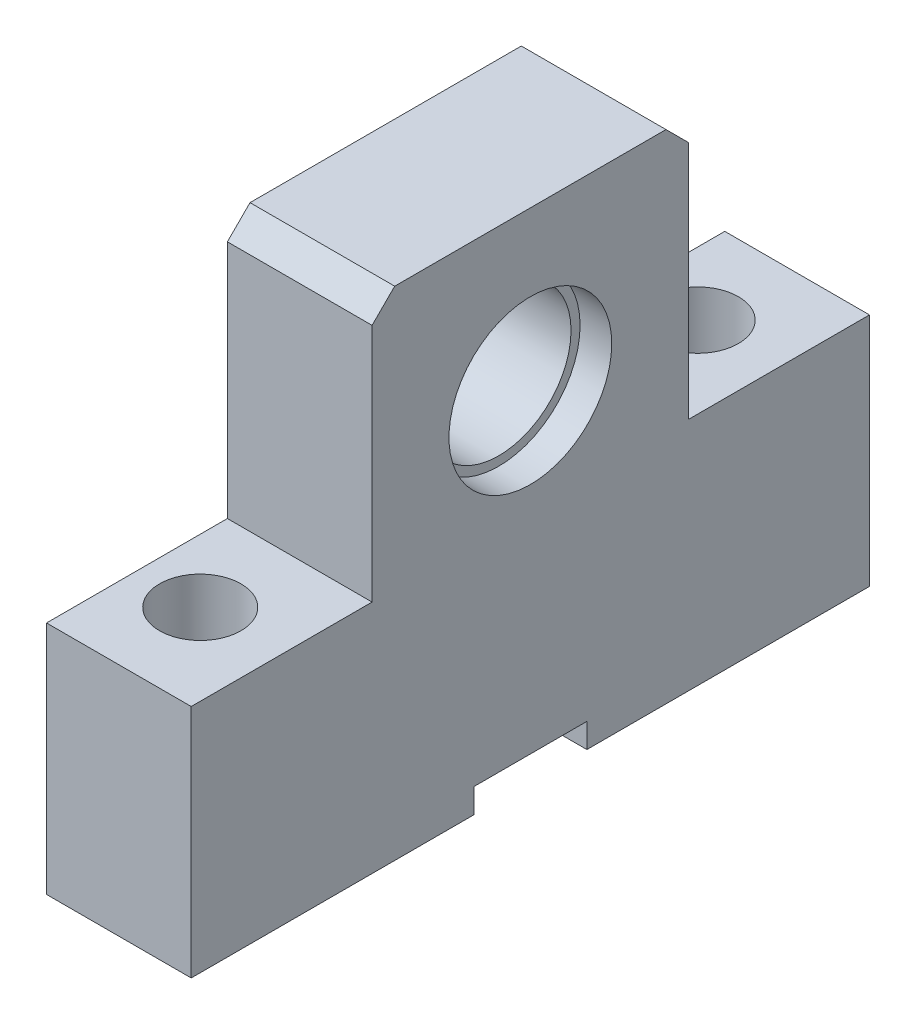
ISO-10303-21;
HEADER;
FILE_DESCRIPTION(('STEP AP214'),'2;1');
FILE_NAME('part.step','',(''),(''),'','','');
FILE_SCHEMA(('AUTOMOTIVE_DESIGN { 1 0 10303 214 1 1 1 1 }'));
ENDSEC;
DATA;
#1=APPLICATION_CONTEXT('core data for automotive mechanical design processes');
#2=APPLICATION_PROTOCOL_DEFINITION('international standard','automotive_design',2000,#1);
#3=PRODUCT_CONTEXT('',#1,'mechanical');
#4=PRODUCT('Part','Part','',(#3));
#5=PRODUCT_RELATED_PRODUCT_CATEGORY('part','',(#4));
#6=PRODUCT_DEFINITION_FORMATION('','',#4);
#7=PRODUCT_DEFINITION_CONTEXT('part definition',#1,'design');
#8=PRODUCT_DEFINITION('design','',#6,#7);
#9=PRODUCT_DEFINITION_SHAPE('','',#8);
#10=(LENGTH_UNIT() NAMED_UNIT(*) SI_UNIT(.MILLI.,.METRE.));
#11=(NAMED_UNIT(*) PLANE_ANGLE_UNIT() SI_UNIT($,.RADIAN.));
#12=(NAMED_UNIT(*) SI_UNIT($,.STERADIAN.) SOLID_ANGLE_UNIT());
#13=UNCERTAINTY_MEASURE_WITH_UNIT(LENGTH_MEASURE(1.E-05),#10,'distance_accuracy_value','');
#14=(GEOMETRIC_REPRESENTATION_CONTEXT(3) GLOBAL_UNCERTAINTY_ASSIGNED_CONTEXT((#13)) GLOBAL_UNIT_ASSIGNED_CONTEXT((#10,
#11,#12)) REPRESENTATION_CONTEXT('',''));
#15=CARTESIAN_POINT('',(0.,0.,0.));
#16=DIRECTION('',(0.,0.,1.));
#17=DIRECTION('',(1.,0.,0.));
#18=AXIS2_PLACEMENT_3D('',#15,#16,#17);
#19=CARTESIAN_POINT('',(33.,-75.,75.));
#20=DIRECTION('',(0.,1.,0.));
#21=DIRECTION('',(0.,0.,1.));
#22=AXIS2_PLACEMENT_3D('',#19,#20,#21);
#23=PLANE('',#22);
#24=CARTESIAN_POINT('',(15.,-75.,55.));
#25=DIRECTION('',(0.,-1.,0.));
#26=DIRECTION('',(0.,0.,1.));
#27=AXIS2_PLACEMENT_3D('',#24,#25,#26);
#28=CIRCLE('',#27,9.);
#29=CARTESIAN_POINT('',(15.,-75.,64.));
#30=VERTEX_POINT('',#29);
#31=EDGE_CURVE('E145',#30,#30,#28,.T.);
#32=ORIENTED_EDGE('',*,*,#31,.F.);
#33=EDGE_LOOP('',(#32));
#34=FACE_BOUND('',#33,.T.);
#35=DIRECTION('',(-1.,0.,0.));
#36=VECTOR('',#35,1.);
#37=CARTESIAN_POINT('',(33.,-75.,12.5));
#38=LINE('',#37,#36);
#39=CARTESIAN_POINT('',(33.,-75.,12.5));
#40=VERTEX_POINT('',#39);
#41=CARTESIAN_POINT('',(1.,-75.,12.5));
#42=VERTEX_POINT('',#41);
#43=EDGE_CURVE('E133',#40,#42,#38,.T.);
#44=ORIENTED_EDGE('',*,*,#43,.F.);
#45=DIRECTION('',(0.,0.,-1.));
#46=VECTOR('',#45,1.);
#47=CARTESIAN_POINT('',(33.,-75.,75.));
#48=LINE('',#47,#46);
#49=CARTESIAN_POINT('',(33.,-75.,75.));
#50=VERTEX_POINT('',#49);
#51=EDGE_CURVE('E121',#50,#40,#48,.T.);
#52=ORIENTED_EDGE('',*,*,#51,.F.);
#53=DIRECTION('',(-1.,0.,0.));
#54=VECTOR('',#53,1.);
#55=CARTESIAN_POINT('',(33.,-75.,75.));
#56=LINE('',#55,#54);
#57=CARTESIAN_POINT('',(1.,-75.,75.));
#58=VERTEX_POINT('',#57);
#59=EDGE_CURVE('E132',#50,#58,#56,.T.);
#60=ORIENTED_EDGE('',*,*,#59,.T.);
#61=DIRECTION('',(0.,0.,-1.));
#62=VECTOR('',#61,1.);
#63=CARTESIAN_POINT('',(1.,-75.,75.));
#64=LINE('',#63,#62);
#65=EDGE_CURVE('E144',#58,#42,#64,.T.);
#66=ORIENTED_EDGE('',*,*,#65,.T.);
#67=EDGE_LOOP('',(#44,#52,#60,#66));
#68=FACE_BOUND('',#67,.T.);
#69=ADVANCED_FACE('F17',(#34,#68),#23,.F.);
#70=CARTESIAN_POINT('',(15.,-150.,55.));
#71=DIRECTION('',(0.,-1.,0.));
#72=DIRECTION('',(0.,0.,-1.));
#73=AXIS2_PLACEMENT_3D('',#70,#71,#72);
#74=CYLINDRICAL_SURFACE('',#73,9.);
#75=ORIENTED_EDGE('',*,*,#31,.T.);
#76=EDGE_LOOP('',(#75));
#77=FACE_BOUND('',#76,.T.);
#78=CARTESIAN_POINT('',(15.,-23.,55.));
#79=DIRECTION('',(0.,1.,0.));
#80=DIRECTION('',(0.,0.,-1.));
#81=AXIS2_PLACEMENT_3D('',#78,#79,#80);
#82=CIRCLE('',#81,9.);
#83=CARTESIAN_POINT('',(15.,-23.,46.));
#84=VERTEX_POINT('',#83);
#85=EDGE_CURVE('E158',#84,#84,#82,.T.);
#86=ORIENTED_EDGE('',*,*,#85,.T.);
#87=EDGE_LOOP('',(#86));
#88=FACE_BOUND('',#87,.T.);
#89=ADVANCED_FACE('F357',(#77,#88),#74,.F.);
#90=CARTESIAN_POINT('',(34.,-69.6,12.5));
#91=DIRECTION('',(0.,0.,-1.));
#92=DIRECTION('',(-1.,0.,0.));
#93=AXIS2_PLACEMENT_3D('',#90,#91,#92);
#94=PLANE('',#93);
#95=ORIENTED_EDGE('',*,*,#43,.T.);
#96=DIRECTION('',(0.,1.,0.));
#97=VECTOR('',#96,1.);
#98=CARTESIAN_POINT('',(1.,-75.,12.5));
#99=LINE('',#98,#97);
#100=CARTESIAN_POINT('',(1.,-69.6,12.5));
#101=VERTEX_POINT('',#100);
#102=EDGE_CURVE('E163',#42,#101,#99,.T.);
#103=ORIENTED_EDGE('',*,*,#102,.T.);
#104=DIRECTION('',(-1.,0.,0.));
#105=VECTOR('',#104,1.);
#106=CARTESIAN_POINT('',(33.,-69.6,12.5));
#107=LINE('',#106,#105);
#108=CARTESIAN_POINT('',(33.,-69.6,12.5));
#109=VERTEX_POINT('',#108);
#110=EDGE_CURVE('E140',#109,#101,#107,.T.);
#111=ORIENTED_EDGE('',*,*,#110,.F.);
#112=DIRECTION('',(0.,1.,0.));
#113=VECTOR('',#112,1.);
#114=CARTESIAN_POINT('',(33.,-75.,12.5));
#115=LINE('',#114,#113);
#116=EDGE_CURVE('E125',#40,#109,#115,.T.);
#117=ORIENTED_EDGE('',*,*,#116,.F.);
#118=EDGE_LOOP('',(#95,#103,#111,#117));
#119=FACE_BOUND('',#118,.T.);
#120=ADVANCED_FACE('F138',(#119),#94,.T.);
#121=CARTESIAN_POINT('',(33.,0.,0.));
#122=DIRECTION('',(1.,0.,0.));
#123=DIRECTION('',(0.,0.,-1.));
#124=AXIS2_PLACEMENT_3D('',#121,#122,#123);
#125=PLANE('',#124);
#126=CARTESIAN_POINT('',(33.,0.,0.));
#127=DIRECTION('',(-1.,0.,0.));
#128=DIRECTION('',(0.,0.,-1.));
#129=AXIS2_PLACEMENT_3D('',#126,#127,#128);
#130=CIRCLE('',#129,18.);
#131=CARTESIAN_POINT('',(33.,0.,-18.));
#132=VERTEX_POINT('',#131);
#133=EDGE_CURVE('E141',#132,#132,#130,.T.);
#134=ORIENTED_EDGE('',*,*,#133,.T.);
#135=EDGE_LOOP('',(#134));
#136=FACE_BOUND('',#135,.T.);
#137=ORIENTED_EDGE('',*,*,#51,.T.);
#138=ORIENTED_EDGE('',*,*,#116,.T.);
#139=DIRECTION('',(0.,0.,-1.));
#140=VECTOR('',#139,1.);
#141=CARTESIAN_POINT('',(33.,-69.6,12.5));
#142=LINE('',#141,#140);
#143=CARTESIAN_POINT('',(33.,-69.6,-12.5));
#144=VERTEX_POINT('',#143);
#145=EDGE_CURVE('E174',#109,#144,#142,.T.);
#146=ORIENTED_EDGE('',*,*,#145,.T.);
#147=DIRECTION('',(0.,-1.,0.));
#148=VECTOR('',#147,1.);
#149=CARTESIAN_POINT('',(33.,-69.6,-12.5));
#150=LINE('',#149,#148);
#151=CARTESIAN_POINT('',(33.,-75.,-12.5));
#152=VERTEX_POINT('',#151);
#153=EDGE_CURVE('E176',#144,#152,#150,.T.);
#154=ORIENTED_EDGE('',*,*,#153,.T.);
#155=DIRECTION('',(0.,0.,-1.));
#156=VECTOR('',#155,1.);
#157=CARTESIAN_POINT('',(33.,-75.,-12.5));
#158=LINE('',#157,#156);
#159=CARTESIAN_POINT('',(33.,-75.,-75.));
#160=VERTEX_POINT('',#159);
#161=EDGE_CURVE('E181',#152,#160,#158,.T.);
#162=ORIENTED_EDGE('',*,*,#161,.T.);
#163=DIRECTION('',(0.,1.,0.));
#164=VECTOR('',#163,1.);
#165=CARTESIAN_POINT('',(33.,-75.,-75.));
#166=LINE('',#165,#164);
#167=CARTESIAN_POINT('',(33.,-23.,-75.));
#168=VERTEX_POINT('',#167);
#169=EDGE_CURVE('E186',#160,#168,#166,.T.);
#170=ORIENTED_EDGE('',*,*,#169,.T.);
#171=DIRECTION('',(0.,0.,1.));
#172=VECTOR('',#171,1.);
#173=CARTESIAN_POINT('',(33.,-23.,-75.));
#174=LINE('',#173,#172);
#175=CARTESIAN_POINT('',(33.,-23.,-35.));
#176=VERTEX_POINT('',#175);
#177=EDGE_CURVE('E191',#168,#176,#174,.T.);
#178=ORIENTED_EDGE('',*,*,#177,.T.);
#179=DIRECTION('',(0.,1.,0.));
#180=VECTOR('',#179,1.);
#181=CARTESIAN_POINT('',(33.,-23.,-35.));
#182=LINE('',#181,#180);
#183=CARTESIAN_POINT('',(33.,30.,-35.));
#184=VERTEX_POINT('',#183);
#185=EDGE_CURVE('E196',#176,#184,#182,.T.);
#186=ORIENTED_EDGE('',*,*,#185,.T.);
#187=DIRECTION('',(0.,0.707106781186548,0.707106781186548));
#188=VECTOR('',#187,1.);
#189=CARTESIAN_POINT('',(33.,30.,-35.));
#190=LINE('',#189,#188);
#191=CARTESIAN_POINT('',(33.,35.,-30.));
#192=VERTEX_POINT('',#191);
#193=EDGE_CURVE('E201',#184,#192,#190,.T.);
#194=ORIENTED_EDGE('',*,*,#193,.T.);
#195=DIRECTION('',(0.,0.,1.));
#196=VECTOR('',#195,1.);
#197=CARTESIAN_POINT('',(33.,35.,-30.));
#198=LINE('',#197,#196);
#199=CARTESIAN_POINT('',(33.,35.,30.));
#200=VERTEX_POINT('',#199);
#201=EDGE_CURVE('E206',#192,#200,#198,.T.);
#202=ORIENTED_EDGE('',*,*,#201,.T.);
#203=DIRECTION('',(0.,-0.707106781186548,0.707106781186548));
#204=VECTOR('',#203,1.);
#205=CARTESIAN_POINT('',(33.,35.,30.));
#206=LINE('',#205,#204);
#207=CARTESIAN_POINT('',(33.,30.,35.));
#208=VERTEX_POINT('',#207);
#209=EDGE_CURVE('E211',#200,#208,#206,.T.);
#210=ORIENTED_EDGE('',*,*,#209,.T.);
#211=DIRECTION('',(0.,-1.,0.));
#212=VECTOR('',#211,1.);
#213=CARTESIAN_POINT('',(33.,30.,35.));
#214=LINE('',#213,#212);
#215=CARTESIAN_POINT('',(33.,-23.,35.));
#216=VERTEX_POINT('',#215);
#217=EDGE_CURVE('E216',#208,#216,#214,.T.);
#218=ORIENTED_EDGE('',*,*,#217,.T.);
#219=DIRECTION('',(0.,0.,1.));
#220=VECTOR('',#219,1.);
#221=CARTESIAN_POINT('',(33.,-23.,35.));
#222=LINE('',#221,#220);
#223=CARTESIAN_POINT('',(33.,-23.,75.));
#224=VERTEX_POINT('',#223);
#225=EDGE_CURVE('E221',#216,#224,#222,.T.);
#226=ORIENTED_EDGE('',*,*,#225,.T.);
#227=DIRECTION('',(0.,-1.,0.));
#228=VECTOR('',#227,1.);
#229=CARTESIAN_POINT('',(33.,-23.,75.));
#230=LINE('',#229,#228);
#231=EDGE_CURVE('E128',#224,#50,#230,.T.);
#232=ORIENTED_EDGE('',*,*,#231,.T.);
#233=EDGE_LOOP('',(#137,#138,#146,#154,#162,#170,#178,#186,#194,#202,#210,#218,#226,#232));
#234=FACE_BOUND('',#233,.T.);
#235=ADVANCED_FACE('F123',(#136,#234),#125,.T.);
#236=CARTESIAN_POINT('',(33.,-23.,75.));
#237=DIRECTION('',(0.,0.,-1.));
#238=DIRECTION('',(-1.,0.,0.));
#239=AXIS2_PLACEMENT_3D('',#236,#237,#238);
#240=PLANE('',#239);
#241=DIRECTION('',(-1.,0.,0.));
#242=VECTOR('',#241,1.);
#243=CARTESIAN_POINT('',(33.,-23.,75.));
#244=LINE('',#243,#242);
#245=CARTESIAN_POINT('',(1.,-23.,75.));
#246=VERTEX_POINT('',#245);
#247=EDGE_CURVE('E228',#224,#246,#244,.T.);
#248=ORIENTED_EDGE('',*,*,#247,.T.);
#249=DIRECTION('',(0.,-1.,0.));
#250=VECTOR('',#249,1.);
#251=CARTESIAN_POINT('',(1.,-23.,75.));
#252=LINE('',#251,#250);
#253=EDGE_CURVE('E233',#246,#58,#252,.T.);
#254=ORIENTED_EDGE('',*,*,#253,.T.);
#255=ORIENTED_EDGE('',*,*,#59,.F.);
#256=ORIENTED_EDGE('',*,*,#231,.F.);
#257=EDGE_LOOP('',(#248,#254,#255,#256));
#258=FACE_BOUND('',#257,.T.);
#259=ADVANCED_FACE('F576',(#258),#240,.F.);
#260=CARTESIAN_POINT('',(1.,0.,0.));
#261=DIRECTION('',(1.,0.,0.));
#262=DIRECTION('',(0.,0.,-1.));
#263=AXIS2_PLACEMENT_3D('',#260,#261,#262);
#264=PLANE('',#263);
#265=CARTESIAN_POINT('',(1.,0.,0.));
#266=DIRECTION('',(-1.,0.,0.));
#267=DIRECTION('',(0.,0.,-1.));
#268=AXIS2_PLACEMENT_3D('',#265,#266,#267);
#269=CIRCLE('',#268,17.);
#270=CARTESIAN_POINT('',(1.,0.,-17.));
#271=VERTEX_POINT('',#270);
#272=EDGE_CURVE('E238',#271,#271,#269,.T.);
#273=ORIENTED_EDGE('',*,*,#272,.F.);
#274=EDGE_LOOP('',(#273));
#275=FACE_BOUND('',#274,.T.);
#276=ORIENTED_EDGE('',*,*,#102,.F.);
#277=ORIENTED_EDGE('',*,*,#65,.F.);
#278=ORIENTED_EDGE('',*,*,#253,.F.);
#279=DIRECTION('',(0.,0.,1.));
#280=VECTOR('',#279,1.);
#281=CARTESIAN_POINT('',(1.,-23.,35.));
#282=LINE('',#281,#280);
#283=CARTESIAN_POINT('',(1.,-23.,35.));
#284=VERTEX_POINT('',#283);
#285=EDGE_CURVE('E243',#284,#246,#282,.T.);
#286=ORIENTED_EDGE('',*,*,#285,.F.);
#287=DIRECTION('',(0.,-1.,0.));
#288=VECTOR('',#287,1.);
#289=CARTESIAN_POINT('',(1.,30.,35.));
#290=LINE('',#289,#288);
#291=CARTESIAN_POINT('',(1.,30.,35.));
#292=VERTEX_POINT('',#291);
#293=EDGE_CURVE('E245',#292,#284,#290,.T.);
#294=ORIENTED_EDGE('',*,*,#293,.F.);
#295=DIRECTION('',(0.,-0.707106781186548,0.707106781186548));
#296=VECTOR('',#295,1.);
#297=CARTESIAN_POINT('',(1.,35.,30.));
#298=LINE('',#297,#296);
#299=CARTESIAN_POINT('',(1.,35.,30.));
#300=VERTEX_POINT('',#299);
#301=EDGE_CURVE('E249',#300,#292,#298,.T.);
#302=ORIENTED_EDGE('',*,*,#301,.F.);
#303=DIRECTION('',(0.,0.,1.));
#304=VECTOR('',#303,1.);
#305=CARTESIAN_POINT('',(1.,35.,-30.));
#306=LINE('',#305,#304);
#307=CARTESIAN_POINT('',(1.,35.,-30.));
#308=VERTEX_POINT('',#307);
#309=EDGE_CURVE('E254',#308,#300,#306,.T.);
#310=ORIENTED_EDGE('',*,*,#309,.F.);
#311=DIRECTION('',(0.,0.707106781186548,0.707106781186548));
#312=VECTOR('',#311,1.);
#313=CARTESIAN_POINT('',(1.,30.,-35.));
#314=LINE('',#313,#312);
#315=CARTESIAN_POINT('',(1.,30.,-35.));
#316=VERTEX_POINT('',#315);
#317=EDGE_CURVE('E259',#316,#308,#314,.T.);
#318=ORIENTED_EDGE('',*,*,#317,.F.);
#319=DIRECTION('',(0.,1.,0.));
#320=VECTOR('',#319,1.);
#321=CARTESIAN_POINT('',(1.,-23.,-35.));
#322=LINE('',#321,#320);
#323=CARTESIAN_POINT('',(1.,-23.,-35.));
#324=VERTEX_POINT('',#323);
#325=EDGE_CURVE('E264',#324,#316,#322,.T.);
#326=ORIENTED_EDGE('',*,*,#325,.F.);
#327=DIRECTION('',(0.,0.,1.));
#328=VECTOR('',#327,1.);
#329=CARTESIAN_POINT('',(1.,-23.,-75.));
#330=LINE('',#329,#328);
#331=CARTESIAN_POINT('',(1.,-23.,-75.));
#332=VERTEX_POINT('',#331);
#333=EDGE_CURVE('E269',#332,#324,#330,.T.);
#334=ORIENTED_EDGE('',*,*,#333,.F.);
#335=DIRECTION('',(0.,1.,0.));
#336=VECTOR('',#335,1.);
#337=CARTESIAN_POINT('',(1.,-75.,-75.));
#338=LINE('',#337,#336);
#339=CARTESIAN_POINT('',(1.,-75.,-75.));
#340=VERTEX_POINT('',#339);
#341=EDGE_CURVE('E274',#340,#332,#338,.T.);
#342=ORIENTED_EDGE('',*,*,#341,.F.);
#343=DIRECTION('',(0.,0.,-1.));
#344=VECTOR('',#343,1.);
#345=CARTESIAN_POINT('',(1.,-75.,-12.5));
#346=LINE('',#345,#344);
#347=CARTESIAN_POINT('',(1.,-75.,-12.5));
#348=VERTEX_POINT('',#347);
#349=EDGE_CURVE('E279',#348,#340,#346,.T.);
#350=ORIENTED_EDGE('',*,*,#349,.F.);
#351=DIRECTION('',(0.,-1.,0.));
#352=VECTOR('',#351,1.);
#353=CARTESIAN_POINT('',(1.,-69.6,-12.5));
#354=LINE('',#353,#352);
#355=CARTESIAN_POINT('',(1.,-69.6,-12.5));
#356=VERTEX_POINT('',#355);
#357=EDGE_CURVE('E283',#356,#348,#354,.T.);
#358=ORIENTED_EDGE('',*,*,#357,.F.);
#359=DIRECTION('',(0.,0.,-1.));
#360=VECTOR('',#359,1.);
#361=CARTESIAN_POINT('',(1.,-69.6,12.5));
#362=LINE('',#361,#360);
#363=EDGE_CURVE('E287',#101,#356,#362,.T.);
#364=ORIENTED_EDGE('',*,*,#363,.F.);
#365=EDGE_LOOP('',(#276,#277,#278,#286,#294,#302,#310,#318,#326,#334,#342,#350,#358,#364));
#366=FACE_BOUND('',#365,.T.);
#367=ADVANCED_FACE('F566',(#275,#366),#264,.F.);
#368=CARTESIAN_POINT('',(33.,-23.,35.));
#369=DIRECTION('',(0.,-1.,0.));
#370=DIRECTION('',(0.,0.,-1.));
#371=AXIS2_PLACEMENT_3D('',#368,#369,#370);
#372=PLANE('',#371);
#373=ORIENTED_EDGE('',*,*,#85,.F.);
#374=EDGE_LOOP('',(#373));
#375=FACE_BOUND('',#374,.T.);
#376=DIRECTION('',(-1.,0.,0.));
#377=VECTOR('',#376,1.);
#378=CARTESIAN_POINT('',(33.,-23.,35.));
#379=LINE('',#378,#377);
#380=EDGE_CURVE('E292',#216,#284,#379,.T.);
#381=ORIENTED_EDGE('',*,*,#380,.T.);
#382=ORIENTED_EDGE('',*,*,#285,.T.);
#383=ORIENTED_EDGE('',*,*,#247,.F.);
#384=ORIENTED_EDGE('',*,*,#225,.F.);
#385=EDGE_LOOP('',(#381,#382,#383,#384));
#386=FACE_BOUND('',#385,.T.);
#387=ADVANCED_FACE('F557',(#375,#386),#372,.F.);
#388=CARTESIAN_POINT('',(34.,-69.6,-12.5));
#389=DIRECTION('',(0.,-1.,0.));
#390=DIRECTION('',(0.,0.,-1.));
#391=AXIS2_PLACEMENT_3D('',#388,#389,#390);
#392=PLANE('',#391);
#393=ORIENTED_EDGE('',*,*,#110,.T.);
#394=ORIENTED_EDGE('',*,*,#363,.T.);
#395=DIRECTION('',(-1.,0.,0.));
#396=VECTOR('',#395,1.);
#397=CARTESIAN_POINT('',(33.,-69.6,-12.5));
#398=LINE('',#397,#396);
#399=EDGE_CURVE('E32',#144,#356,#398,.T.);
#400=ORIENTED_EDGE('',*,*,#399,.F.);
#401=ORIENTED_EDGE('',*,*,#145,.F.);
#402=EDGE_LOOP('',(#393,#394,#400,#401));
#403=FACE_BOUND('',#402,.T.);
#404=ADVANCED_FACE('F385',(#403),#392,.T.);
#405=CARTESIAN_POINT('',(34.,0.,0.));
#406=DIRECTION('',(1.,0.,0.));
#407=DIRECTION('',(0.,0.,-1.));
#408=AXIS2_PLACEMENT_3D('',#405,#406,#407);
#409=CYLINDRICAL_SURFACE('',#408,18.);
#410=ORIENTED_EDGE('',*,*,#133,.F.);
#411=EDGE_LOOP('',(#410));
#412=FACE_BOUND('',#411,.T.);
#413=CARTESIAN_POINT('',(26.,0.,0.));
#414=DIRECTION('',(1.,0.,0.));
#415=DIRECTION('',(0.,0.,-1.));
#416=AXIS2_PLACEMENT_3D('',#413,#414,#415);
#417=CIRCLE('',#416,18.);
#418=CARTESIAN_POINT('',(26.,0.,-18.));
#419=VERTEX_POINT('',#418);
#420=EDGE_CURVE('E300',#419,#419,#417,.T.);
#421=ORIENTED_EDGE('',*,*,#420,.F.);
#422=EDGE_LOOP('',(#421));
#423=FACE_BOUND('',#422,.T.);
#424=ADVANCED_FACE('F378',(#412,#423),#409,.F.);
#425=CARTESIAN_POINT('',(34.,-150.,-12.5));
#426=DIRECTION('',(0.,0.,1.));
#427=DIRECTION('',(1.,0.,0.));
#428=AXIS2_PLACEMENT_3D('',#425,#426,#427);
#429=PLANE('',#428);
#430=ORIENTED_EDGE('',*,*,#399,.T.);
#431=ORIENTED_EDGE('',*,*,#357,.T.);
#432=DIRECTION('',(1.,0.,0.));
#433=VECTOR('',#432,1.);
#434=CARTESIAN_POINT('',(1.,-75.,-12.5));
#435=LINE('',#434,#433);
#436=EDGE_CURVE('E40',#348,#152,#435,.T.);
#437=ORIENTED_EDGE('',*,*,#436,.T.);
#438=ORIENTED_EDGE('',*,*,#153,.F.);
#439=EDGE_LOOP('',(#430,#431,#437,#438));
#440=FACE_BOUND('',#439,.T.);
#441=ADVANCED_FACE('F369',(#440),#429,.T.);
#442=CARTESIAN_POINT('',(15.,-75.,-55.));
#443=DIRECTION('',(0.,-1.,0.));
#444=DIRECTION('',(0.,0.,1.));
#445=AXIS2_PLACEMENT_3D('',#442,#443,#444);
#446=CIRCLE('',#445,9.);
#447=CARTESIAN_POINT('',(15.,-75.,-46.));
#448=VERTEX_POINT('',#447);
#449=EDGE_CURVE('E306',#448,#448,#446,.T.);
#450=ORIENTED_EDGE('',*,*,#449,.F.);
#451=EDGE_LOOP('',(#450));
#452=FACE_BOUND('',#451,.T.);
#453=ORIENTED_EDGE('',*,*,#436,.F.);
#454=ORIENTED_EDGE('',*,*,#349,.T.);
#455=DIRECTION('',(-1.,0.,0.));
#456=VECTOR('',#455,1.);
#457=CARTESIAN_POINT('',(33.,-75.,-75.));
#458=LINE('',#457,#456);
#459=EDGE_CURVE('E311',#160,#340,#458,.T.);
#460=ORIENTED_EDGE('',*,*,#459,.F.);
#461=ORIENTED_EDGE('',*,*,#161,.F.);
#462=EDGE_LOOP('',(#453,#454,#460,#461));
#463=FACE_BOUND('',#462,.T.);
#464=ADVANCED_FACE('F360',(#452,#463),#23,.F.);
#465=CARTESIAN_POINT('',(33.,-75.,-75.));
#466=DIRECTION('',(0.,0.,1.));
#467=DIRECTION('',(1.,0.,0.));
#468=AXIS2_PLACEMENT_3D('',#465,#466,#467);
#469=PLANE('',#468);
#470=ORIENTED_EDGE('',*,*,#459,.T.);
#471=ORIENTED_EDGE('',*,*,#341,.T.);
#472=DIRECTION('',(-1.,0.,0.));
#473=VECTOR('',#472,1.);
#474=CARTESIAN_POINT('',(33.,-23.,-75.));
#475=LINE('',#474,#473);
#476=EDGE_CURVE('E313',#168,#332,#475,.T.);
#477=ORIENTED_EDGE('',*,*,#476,.F.);
#478=ORIENTED_EDGE('',*,*,#169,.F.);
#479=EDGE_LOOP('',(#470,#471,#477,#478));
#480=FACE_BOUND('',#479,.T.);
#481=ADVANCED_FACE('F368',(#480),#469,.F.);
#482=CARTESIAN_POINT('',(33.,-23.,-75.));
#483=DIRECTION('',(0.,-1.,0.));
#484=DIRECTION('',(0.,0.,-1.));
#485=AXIS2_PLACEMENT_3D('',#482,#483,#484);
#486=PLANE('',#485);
#487=CARTESIAN_POINT('',(15.,-23.,-55.));
#488=DIRECTION('',(0.,1.,0.));
#489=DIRECTION('',(0.,0.,-1.));
#490=AXIS2_PLACEMENT_3D('',#487,#488,#489);
#491=CIRCLE('',#490,9.);
#492=CARTESIAN_POINT('',(15.,-23.,-64.));
#493=VERTEX_POINT('',#492);
#494=EDGE_CURVE('E317',#493,#493,#491,.T.);
#495=ORIENTED_EDGE('',*,*,#494,.F.);
#496=EDGE_LOOP('',(#495));
#497=FACE_BOUND('',#496,.T.);
#498=ORIENTED_EDGE('',*,*,#476,.T.);
#499=ORIENTED_EDGE('',*,*,#333,.T.);
#500=DIRECTION('',(-1.,0.,0.));
#501=VECTOR('',#500,1.);
#502=CARTESIAN_POINT('',(33.,-23.,-35.));
#503=LINE('',#502,#501);
#504=EDGE_CURVE('E322',#176,#324,#503,.T.);
#505=ORIENTED_EDGE('',*,*,#504,.F.);
#506=ORIENTED_EDGE('',*,*,#177,.F.);
#507=EDGE_LOOP('',(#498,#499,#505,#506));
#508=FACE_BOUND('',#507,.T.);
#509=ADVANCED_FACE('F375',(#497,#508),#486,.F.);
#510=CARTESIAN_POINT('',(33.,-23.,-35.));
#511=DIRECTION('',(0.,0.,1.));
#512=DIRECTION('',(1.,0.,0.));
#513=AXIS2_PLACEMENT_3D('',#510,#511,#512);
#514=PLANE('',#513);
#515=ORIENTED_EDGE('',*,*,#504,.T.);
#516=ORIENTED_EDGE('',*,*,#325,.T.);
#517=DIRECTION('',(-1.,0.,0.));
#518=VECTOR('',#517,1.);
#519=CARTESIAN_POINT('',(33.,30.,-35.));
#520=LINE('',#519,#518);
#521=EDGE_CURVE('E324',#184,#316,#520,.T.);
#522=ORIENTED_EDGE('',*,*,#521,.F.);
#523=ORIENTED_EDGE('',*,*,#185,.F.);
#524=EDGE_LOOP('',(#515,#516,#522,#523));
#525=FACE_BOUND('',#524,.T.);
#526=ADVANCED_FACE('F392',(#525),#514,.F.);
#527=CARTESIAN_POINT('',(33.,30.,-35.));
#528=DIRECTION('',(0.,-0.707106781186548,0.707106781186548));
#529=DIRECTION('',(0.,-0.707106781186548,-0.707106781186548));
#530=AXIS2_PLACEMENT_3D('',#527,#528,#529);
#531=PLANE('',#530);
#532=ORIENTED_EDGE('',*,*,#521,.T.);
#533=ORIENTED_EDGE('',*,*,#317,.T.);
#534=DIRECTION('',(-1.,0.,0.));
#535=VECTOR('',#534,1.);
#536=CARTESIAN_POINT('',(33.,35.,-30.));
#537=LINE('',#536,#535);
#538=EDGE_CURVE('E328',#192,#308,#537,.T.);
#539=ORIENTED_EDGE('',*,*,#538,.F.);
#540=ORIENTED_EDGE('',*,*,#193,.F.);
#541=EDGE_LOOP('',(#532,#533,#539,#540));
#542=FACE_BOUND('',#541,.T.);
#543=ADVANCED_FACE('F396',(#542),#531,.F.);
#544=CARTESIAN_POINT('',(33.,35.,-30.));
#545=DIRECTION('',(0.,-1.,0.));
#546=DIRECTION('',(0.,0.,-1.));
#547=AXIS2_PLACEMENT_3D('',#544,#545,#546);
#548=PLANE('',#547);
#549=ORIENTED_EDGE('',*,*,#538,.T.);
#550=ORIENTED_EDGE('',*,*,#309,.T.);
#551=DIRECTION('',(-1.,0.,0.));
#552=VECTOR('',#551,1.);
#553=CARTESIAN_POINT('',(33.,35.,30.));
#554=LINE('',#553,#552);
#555=EDGE_CURVE('E332',#200,#300,#554,.T.);
#556=ORIENTED_EDGE('',*,*,#555,.F.);
#557=ORIENTED_EDGE('',*,*,#201,.F.);
#558=EDGE_LOOP('',(#549,#550,#556,#557));
#559=FACE_BOUND('',#558,.T.);
#560=ADVANCED_FACE('F400',(#559),#548,.F.);
#561=CARTESIAN_POINT('',(33.,35.,30.));
#562=DIRECTION('',(0.,-0.707106781186548,-0.707106781186548));
#563=DIRECTION('',(0.,0.707106781186548,-0.707106781186548));
#564=AXIS2_PLACEMENT_3D('',#561,#562,#563);
#565=PLANE('',#564);
#566=ORIENTED_EDGE('',*,*,#555,.T.);
#567=ORIENTED_EDGE('',*,*,#301,.T.);
#568=DIRECTION('',(-1.,0.,0.));
#569=VECTOR('',#568,1.);
#570=CARTESIAN_POINT('',(33.,30.,35.));
#571=LINE('',#570,#569);
#572=EDGE_CURVE('E336',#208,#292,#571,.T.);
#573=ORIENTED_EDGE('',*,*,#572,.F.);
#574=ORIENTED_EDGE('',*,*,#209,.F.);
#575=EDGE_LOOP('',(#566,#567,#573,#574));
#576=FACE_BOUND('',#575,.T.);
#577=ADVANCED_FACE('F404',(#576),#565,.F.);
#578=CARTESIAN_POINT('',(33.,30.,35.));
#579=DIRECTION('',(0.,0.,-1.));
#580=DIRECTION('',(-1.,0.,0.));
#581=AXIS2_PLACEMENT_3D('',#578,#579,#580);
#582=PLANE('',#581);
#583=ORIENTED_EDGE('',*,*,#572,.T.);
#584=ORIENTED_EDGE('',*,*,#293,.T.);
#585=ORIENTED_EDGE('',*,*,#380,.F.);
#586=ORIENTED_EDGE('',*,*,#217,.F.);
#587=EDGE_LOOP('',(#583,#584,#585,#586));
#588=FACE_BOUND('',#587,.T.);
#589=ADVANCED_FACE('F408',(#588),#582,.F.);
#590=CARTESIAN_POINT('',(0.,0.,0.));
#591=DIRECTION('',(-1.,0.,0.));
#592=DIRECTION('',(0.,0.,1.));
#593=AXIS2_PLACEMENT_3D('',#590,#591,#592);
#594=CONICAL_SURFACE('',#593,18.,0.785398163397448);
#595=CARTESIAN_POINT('',(2.,0.,0.));
#596=DIRECTION('',(1.,0.,0.));
#597=DIRECTION('',(0.,0.,-1.));
#598=AXIS2_PLACEMENT_3D('',#595,#596,#597);
#599=CIRCLE('',#598,16.);
#600=CARTESIAN_POINT('',(2.,0.,-16.));
#601=VERTEX_POINT('',#600);
#602=EDGE_CURVE('E25',#601,#601,#599,.T.);
#603=ORIENTED_EDGE('',*,*,#602,.T.);
#604=EDGE_LOOP('',(#603));
#605=FACE_BOUND('',#604,.T.);
#606=ORIENTED_EDGE('',*,*,#272,.T.);
#607=EDGE_LOOP('',(#606));
#608=FACE_BOUND('',#607,.T.);
#609=ADVANCED_FACE('F344',(#605,#608),#594,.F.);
#610=CARTESIAN_POINT('',(26.,16.,0.));
#611=DIRECTION('',(1.,0.,0.));
#612=DIRECTION('',(0.,0.,-1.));
#613=AXIS2_PLACEMENT_3D('',#610,#611,#612);
#614=PLANE('',#613);
#615=ORIENTED_EDGE('',*,*,#420,.T.);
#616=EDGE_LOOP('',(#615));
#617=FACE_BOUND('',#616,.T.);
#618=CARTESIAN_POINT('',(26.,0.,0.));
#619=DIRECTION('',(1.,0.,0.));
#620=DIRECTION('',(0.,0.,-1.));
#621=AXIS2_PLACEMENT_3D('',#618,#619,#620);
#622=CIRCLE('',#621,16.);
#623=CARTESIAN_POINT('',(26.,0.,-16.));
#624=VERTEX_POINT('',#623);
#625=EDGE_CURVE('E11',#624,#624,#622,.T.);
#626=ORIENTED_EDGE('',*,*,#625,.F.);
#627=EDGE_LOOP('',(#626));
#628=FACE_BOUND('',#627,.T.);
#629=ADVANCED_FACE('F354',(#617,#628),#614,.T.);
#630=CARTESIAN_POINT('',(15.,-150.,-55.));
#631=DIRECTION('',(0.,-1.,0.));
#632=DIRECTION('',(0.,0.,-1.));
#633=AXIS2_PLACEMENT_3D('',#630,#631,#632);
#634=CYLINDRICAL_SURFACE('',#633,9.);
#635=ORIENTED_EDGE('',*,*,#494,.T.);
#636=EDGE_LOOP('',(#635));
#637=FACE_BOUND('',#636,.T.);
#638=ORIENTED_EDGE('',*,*,#449,.T.);
#639=EDGE_LOOP('',(#638));
#640=FACE_BOUND('',#639,.T.);
#641=ADVANCED_FACE('F348',(#637,#640),#634,.F.);
#642=CARTESIAN_POINT('',(34.,0.,0.));
#643=DIRECTION('',(1.,0.,0.));
#644=DIRECTION('',(0.,0.,-1.));
#645=AXIS2_PLACEMENT_3D('',#642,#643,#644);
#646=CYLINDRICAL_SURFACE('',#645,16.);
#647=ORIENTED_EDGE('',*,*,#625,.T.);
#648=EDGE_LOOP('',(#647));
#649=FACE_BOUND('',#648,.T.);
#650=ORIENTED_EDGE('',*,*,#602,.F.);
#651=EDGE_LOOP('',(#650));
#652=FACE_BOUND('',#651,.T.);
#653=ADVANCED_FACE('F19',(#649,#652),#646,.F.);
#654=CLOSED_SHELL('',(#69,#89,#120,#235,#259,#367,#387,#404,#424,#441,#464,#481,#509,#526,#543,
#560,#577,#589,#609,#629,#641,#653));
#655=MANIFOLD_SOLID_BREP('B1',#654);
#656=ADVANCED_BREP_SHAPE_REPRESENTATION('',(#18,#655),#14);
#657=SHAPE_DEFINITION_REPRESENTATION(#9,#656);
ENDSEC;
END-ISO-10303-21;
